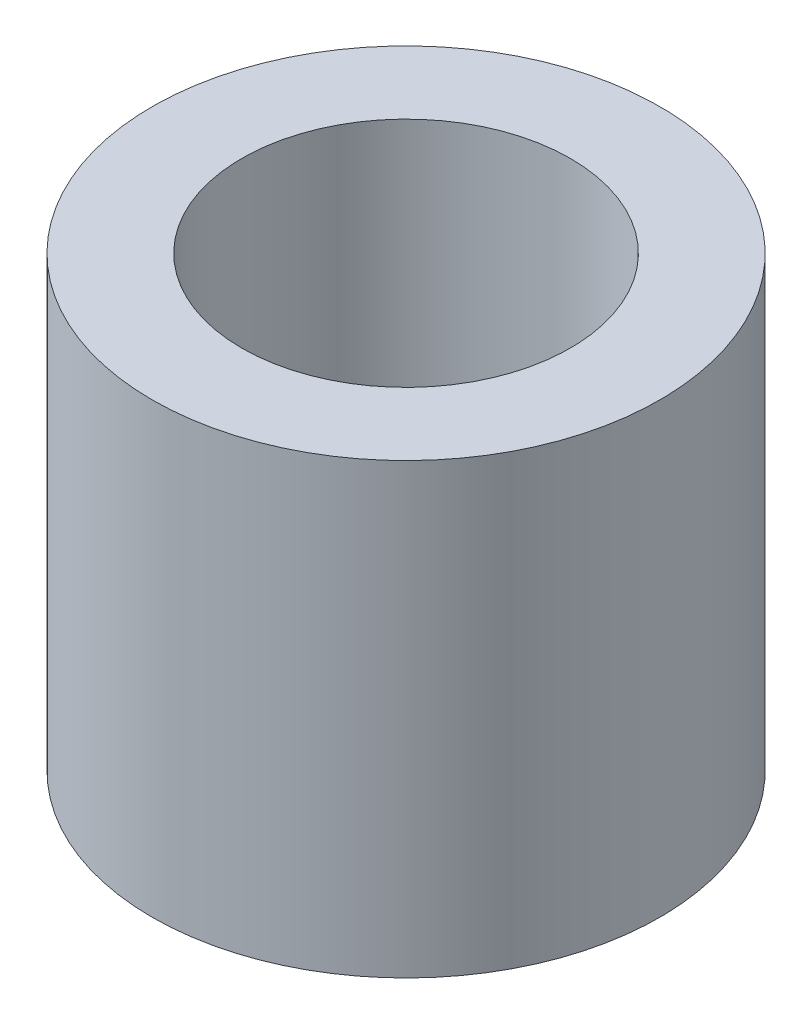
ISO-10303-21;
HEADER;
FILE_DESCRIPTION(('STEP AP214'),'2;1');
FILE_NAME('part.step','',(''),(''),'','','');
FILE_SCHEMA(('AUTOMOTIVE_DESIGN { 1 0 10303 214 1 1 1 1 }'));
ENDSEC;
DATA;
#1=APPLICATION_CONTEXT('core data for automotive mechanical design processes');
#2=APPLICATION_PROTOCOL_DEFINITION('international standard','automotive_design',2000,#1);
#3=PRODUCT_CONTEXT('',#1,'mechanical');
#4=PRODUCT('Part','Part','',(#3));
#5=PRODUCT_RELATED_PRODUCT_CATEGORY('part','',(#4));
#6=PRODUCT_DEFINITION_FORMATION('','',#4);
#7=PRODUCT_DEFINITION_CONTEXT('part definition',#1,'design');
#8=PRODUCT_DEFINITION('design','',#6,#7);
#9=PRODUCT_DEFINITION_SHAPE('','',#8);
#10=(LENGTH_UNIT() NAMED_UNIT(*) SI_UNIT(.MILLI.,.METRE.));
#11=(NAMED_UNIT(*) PLANE_ANGLE_UNIT() SI_UNIT($,.RADIAN.));
#12=(NAMED_UNIT(*) SI_UNIT($,.STERADIAN.) SOLID_ANGLE_UNIT());
#13=UNCERTAINTY_MEASURE_WITH_UNIT(LENGTH_MEASURE(1.E-05),#10,'distance_accuracy_value','');
#14=(GEOMETRIC_REPRESENTATION_CONTEXT(3) GLOBAL_UNCERTAINTY_ASSIGNED_CONTEXT((#13)) GLOBAL_UNIT_ASSIGNED_CONTEXT((#10,
#11,#12)) REPRESENTATION_CONTEXT('',''));
#15=CARTESIAN_POINT('',(0.,0.,0.));
#16=DIRECTION('',(0.,0.,1.));
#17=DIRECTION('',(1.,0.,0.));
#18=AXIS2_PLACEMENT_3D('',#15,#16,#17);
#19=CARTESIAN_POINT('',(0.,3.,0.));
#20=DIRECTION('',(0.,1.,0.));
#21=DIRECTION('',(0.,0.,1.));
#22=AXIS2_PLACEMENT_3D('',#19,#20,#21);
#23=PLANE('',#22);
#24=CARTESIAN_POINT('',(0.,3.,0.));
#25=DIRECTION('',(0.,1.,0.));
#26=DIRECTION('',(0.,0.,1.));
#27=AXIS2_PLACEMENT_3D('',#24,#25,#26);
#28=CIRCLE('',#27,1.7);
#29=CARTESIAN_POINT('',(0.,3.,1.7));
#30=VERTEX_POINT('',#29);
#31=EDGE_CURVE('E10',#30,#30,#28,.T.);
#32=ORIENTED_EDGE('',*,*,#31,.T.);
#33=EDGE_LOOP('',(#32));
#34=FACE_BOUND('',#33,.T.);
#35=CARTESIAN_POINT('',(0.,3.,0.));
#36=DIRECTION('',(0.,1.,0.));
#37=DIRECTION('',(0.,0.,1.));
#38=AXIS2_PLACEMENT_3D('',#35,#36,#37);
#39=CIRCLE('',#38,1.1);
#40=CARTESIAN_POINT('',(0.,3.,1.1));
#41=VERTEX_POINT('',#40);
#42=EDGE_CURVE('E50',#41,#41,#39,.T.);
#43=ORIENTED_EDGE('',*,*,#42,.F.);
#44=EDGE_LOOP('',(#43));
#45=FACE_BOUND('',#44,.T.);
#46=ADVANCED_FACE('F37',(#34,#45),#23,.T.);
#47=CARTESIAN_POINT('',(0.,0.,0.));
#48=DIRECTION('',(0.,1.,0.));
#49=DIRECTION('',(0.,0.,1.));
#50=AXIS2_PLACEMENT_3D('',#47,#48,#49);
#51=PLANE('',#50);
#52=CARTESIAN_POINT('',(0.,0.,0.));
#53=DIRECTION('',(0.,1.,0.));
#54=DIRECTION('',(0.,0.,1.));
#55=AXIS2_PLACEMENT_3D('',#52,#53,#54);
#56=CIRCLE('',#55,1.7);
#57=CARTESIAN_POINT('',(0.,0.,1.7));
#58=VERTEX_POINT('',#57);
#59=EDGE_CURVE('E41',#58,#58,#56,.T.);
#60=ORIENTED_EDGE('',*,*,#59,.F.);
#61=EDGE_LOOP('',(#60));
#62=FACE_BOUND('',#61,.T.);
#63=CARTESIAN_POINT('',(0.,0.,0.));
#64=DIRECTION('',(0.,1.,0.));
#65=DIRECTION('',(0.,0.,1.));
#66=AXIS2_PLACEMENT_3D('',#63,#64,#65);
#67=CIRCLE('',#66,1.1);
#68=CARTESIAN_POINT('',(0.,0.,1.1));
#69=VERTEX_POINT('',#68);
#70=EDGE_CURVE('E52',#69,#69,#67,.T.);
#71=ORIENTED_EDGE('',*,*,#70,.T.);
#72=EDGE_LOOP('',(#71));
#73=FACE_BOUND('',#72,.T.);
#74=ADVANCED_FACE('F64',(#62,#73),#51,.F.);
#75=CARTESIAN_POINT('',(0.,3.,0.));
#76=DIRECTION('',(0.,-1.,0.));
#77=DIRECTION('',(0.,0.,-1.));
#78=AXIS2_PLACEMENT_3D('',#75,#76,#77);
#79=CYLINDRICAL_SURFACE('',#78,1.7);
#80=ORIENTED_EDGE('',*,*,#31,.F.);
#81=EDGE_LOOP('',(#80));
#82=FACE_BOUND('',#81,.T.);
#83=ORIENTED_EDGE('',*,*,#59,.T.);
#84=EDGE_LOOP('',(#83));
#85=FACE_BOUND('',#84,.T.);
#86=ADVANCED_FACE('F39',(#82,#85),#79,.T.);
#87=CARTESIAN_POINT('',(0.,3.,0.));
#88=DIRECTION('',(0.,-1.,0.));
#89=DIRECTION('',(0.,0.,-1.));
#90=AXIS2_PLACEMENT_3D('',#87,#88,#89);
#91=CYLINDRICAL_SURFACE('',#90,1.1);
#92=ORIENTED_EDGE('',*,*,#42,.T.);
#93=EDGE_LOOP('',(#92));
#94=FACE_BOUND('',#93,.T.);
#95=ORIENTED_EDGE('',*,*,#70,.F.);
#96=EDGE_LOOP('',(#95));
#97=FACE_BOUND('',#96,.T.);
#98=ADVANCED_FACE('F60',(#94,#97),#91,.F.);
#99=CLOSED_SHELL('',(#46,#74,#86,#98));
#100=MANIFOLD_SOLID_BREP('B2',#99);
#101=ADVANCED_BREP_SHAPE_REPRESENTATION('',(#18,#100),#14);
#102=SHAPE_DEFINITION_REPRESENTATION(#9,#101);
ENDSEC;
END-ISO-10303-21;
